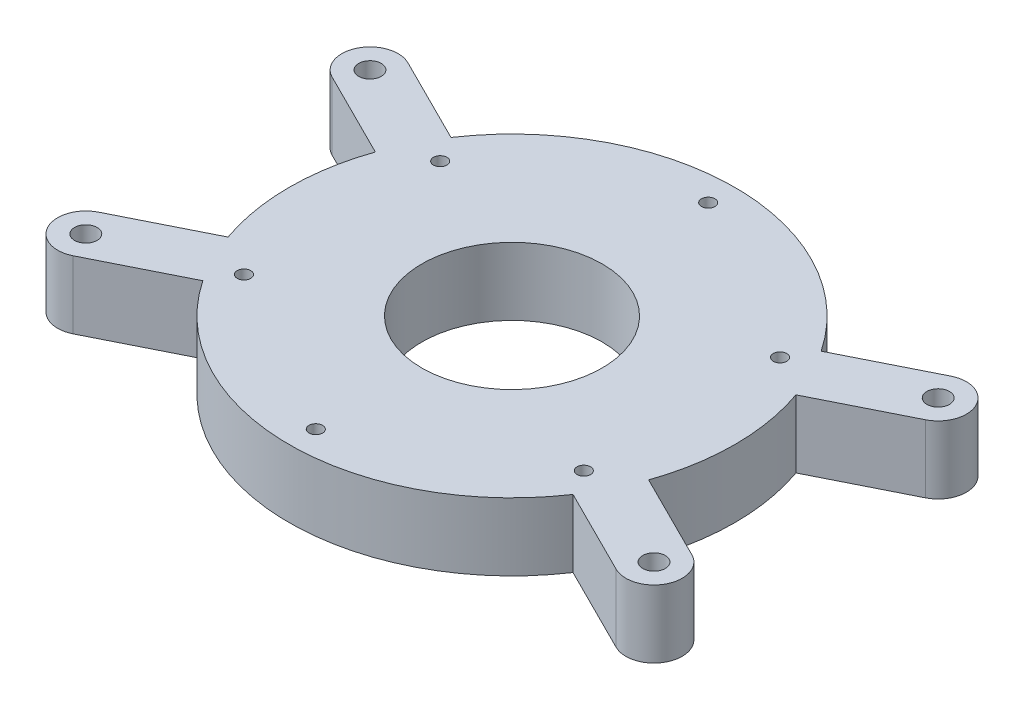
ISO-10303-21;
HEADER;
FILE_DESCRIPTION(('STEP AP214'),'2;1');
FILE_NAME('part.step','',(''),(''),'','','');
FILE_SCHEMA(('AUTOMOTIVE_DESIGN { 1 0 10303 214 1 1 1 1 }'));
ENDSEC;
DATA;
#1=APPLICATION_CONTEXT('core data for automotive mechanical design processes');
#2=APPLICATION_PROTOCOL_DEFINITION('international standard','automotive_design',2000,#1);
#3=PRODUCT_CONTEXT('',#1,'mechanical');
#4=PRODUCT('Part','Part','',(#3));
#5=PRODUCT_RELATED_PRODUCT_CATEGORY('part','',(#4));
#6=PRODUCT_DEFINITION_FORMATION('','',#4);
#7=PRODUCT_DEFINITION_CONTEXT('part definition',#1,'design');
#8=PRODUCT_DEFINITION('design','',#6,#7);
#9=PRODUCT_DEFINITION_SHAPE('','',#8);
#10=(LENGTH_UNIT() NAMED_UNIT(*) SI_UNIT(.MILLI.,.METRE.));
#11=(NAMED_UNIT(*) PLANE_ANGLE_UNIT() SI_UNIT($,.RADIAN.));
#12=(NAMED_UNIT(*) SI_UNIT($,.STERADIAN.) SOLID_ANGLE_UNIT());
#13=UNCERTAINTY_MEASURE_WITH_UNIT(LENGTH_MEASURE(1.E-05),#10,'distance_accuracy_value','');
#14=(GEOMETRIC_REPRESENTATION_CONTEXT(3) GLOBAL_UNCERTAINTY_ASSIGNED_CONTEXT((#13)) GLOBAL_UNIT_ASSIGNED_CONTEXT((#10,
#11,#12)) REPRESENTATION_CONTEXT('',''));
#15=CARTESIAN_POINT('',(0.,0.,0.));
#16=DIRECTION('',(0.,0.,1.));
#17=DIRECTION('',(1.,0.,0.));
#18=AXIS2_PLACEMENT_3D('',#15,#16,#17);
#19=CARTESIAN_POINT('',(0.,15.,0.));
#20=DIRECTION('',(0.,-1.,0.));
#21=DIRECTION('',(0.,0.,-1.));
#22=AXIS2_PLACEMENT_3D('',#19,#20,#21);
#23=CYLINDRICAL_SURFACE('',#22,49.4);
#24=CARTESIAN_POINT('',(0.,0.,0.));
#25=DIRECTION('',(0.,1.,0.));
#26=DIRECTION('',(0.,0.,1.));
#27=AXIS2_PLACEMENT_3D('',#24,#25,#26);
#28=CIRCLE('',#27,49.4);
#29=CARTESIAN_POINT('',(-41.0321866795471,0.,27.5085378799892));
#30=VERTEX_POINT('',#29);
#31=CARTESIAN_POINT('',(41.0321866795471,0.,27.5085378799891));
#32=VERTEX_POINT('',#31);
#33=EDGE_CURVE('E245',#30,#32,#28,.T.);
#34=ORIENTED_EDGE('',*,*,#33,.T.);
#35=DIRECTION('',(0.,-1.,0.));
#36=VECTOR('',#35,1.);
#37=CARTESIAN_POINT('',(41.0321866795471,15.,27.5085378799891));
#38=LINE('',#37,#36);
#39=CARTESIAN_POINT('',(41.0321866795471,15.,27.5085378799891));
#40=VERTEX_POINT('',#39);
#41=EDGE_CURVE('E12',#40,#32,#38,.T.);
#42=ORIENTED_EDGE('',*,*,#41,.F.);
#43=CARTESIAN_POINT('',(0.,15.,0.));
#44=DIRECTION('',(0.,1.,0.));
#45=DIRECTION('',(0.,0.,1.));
#46=AXIS2_PLACEMENT_3D('',#43,#44,#45);
#47=CIRCLE('',#46,49.4);
#48=CARTESIAN_POINT('',(-41.0321866795471,15.,27.5085378799892));
#49=VERTEX_POINT('',#48);
#50=EDGE_CURVE('E175',#49,#40,#47,.T.);
#51=ORIENTED_EDGE('',*,*,#50,.F.);
#52=DIRECTION('',(0.,-1.,0.));
#53=VECTOR('',#52,1.);
#54=CARTESIAN_POINT('',(-41.0321866795471,15.,27.5085378799892));
#55=LINE('',#54,#53);
#56=EDGE_CURVE('E241',#49,#30,#55,.T.);
#57=ORIENTED_EDGE('',*,*,#56,.T.);
#58=EDGE_LOOP('',(#34,#42,#51,#57));
#59=FACE_BOUND('',#58,.T.);
#60=ADVANCED_FACE('F93',(#59),#23,.T.);
#61=CARTESIAN_POINT('',(-2.79556780261693,15.,5.58992850231305));
#62=DIRECTION('',(-0.447290848418707,0.,0.894388560370085));
#63=DIRECTION('',(0.894388560370085,0.,0.447290848418707));
#64=AXIS2_PLACEMENT_3D('',#61,#62,#63);
#65=PLANE('',#64);
#66=DIRECTION('',(-0.894388560370085,0.,-0.447290848418707));
#67=VECTOR('',#66,1.);
#68=CARTESIAN_POINT('',(-2.79556780261693,0.,5.58992850231305));
#69=LINE('',#68,#67);
#70=CARTESIAN_POINT('',(60.1908307594318,0.,37.089928502313));
#71=VERTEX_POINT('',#70);
#72=EDGE_CURVE('E249',#71,#32,#69,.T.);
#73=ORIENTED_EDGE('',*,*,#72,.F.);
#74=DIRECTION('',(0.,-1.,0.));
#75=VECTOR('',#74,1.);
#76=CARTESIAN_POINT('',(60.1908307594318,15.,37.089928502313));
#77=LINE('',#76,#75);
#78=CARTESIAN_POINT('',(60.1908307594318,15.,37.089928502313));
#79=VERTEX_POINT('',#78);
#80=EDGE_CURVE('E103',#79,#71,#77,.T.);
#81=ORIENTED_EDGE('',*,*,#80,.F.);
#82=DIRECTION('',(-0.894388560370085,0.,-0.447290848418707));
#83=VECTOR('',#82,1.);
#84=CARTESIAN_POINT('',(-2.79556780261693,15.,5.58992850231305));
#85=LINE('',#84,#83);
#86=EDGE_CURVE('E327',#79,#40,#85,.T.);
#87=ORIENTED_EDGE('',*,*,#86,.T.);
#88=ORIENTED_EDGE('',*,*,#41,.T.);
#89=EDGE_LOOP('',(#73,#81,#87,#88));
#90=FACE_BOUND('',#89,.T.);
#91=ADVANCED_FACE('F408',(#90),#65,.T.);
#92=CARTESIAN_POINT('',(62.9863985620487,15.,31.5));
#93=DIRECTION('',(0.,-1.,0.));
#94=DIRECTION('',(0.,0.,-1.));
#95=AXIS2_PLACEMENT_3D('',#92,#93,#94);
#96=CYLINDRICAL_SURFACE('',#95,6.25);
#97=CARTESIAN_POINT('',(62.9863985620487,0.,31.5));
#98=DIRECTION('',(0.,1.,0.));
#99=DIRECTION('',(0.,0.,1.));
#100=AXIS2_PLACEMENT_3D('',#97,#98,#99);
#101=CIRCLE('',#100,6.25);
#102=CARTESIAN_POINT('',(65.7819663646656,0.,25.9100714976869));
#103=VERTEX_POINT('',#102);
#104=EDGE_CURVE('E254',#103,#71,#101,.F.);
#105=ORIENTED_EDGE('',*,*,#104,.F.);
#106=DIRECTION('',(0.,-1.,0.));
#107=VECTOR('',#106,1.);
#108=CARTESIAN_POINT('',(65.7819663646656,15.,25.9100714976869));
#109=LINE('',#108,#107);
#110=CARTESIAN_POINT('',(65.7819663646656,15.,25.9100714976869));
#111=VERTEX_POINT('',#110);
#112=EDGE_CURVE('E301',#111,#103,#109,.T.);
#113=ORIENTED_EDGE('',*,*,#112,.F.);
#114=CARTESIAN_POINT('',(62.9863985620487,15.,31.5));
#115=DIRECTION('',(0.,1.,0.));
#116=DIRECTION('',(0.,0.,1.));
#117=AXIS2_PLACEMENT_3D('',#114,#115,#116);
#118=CIRCLE('',#117,6.25);
#119=EDGE_CURVE('E331',#111,#79,#118,.F.);
#120=ORIENTED_EDGE('',*,*,#119,.T.);
#121=ORIENTED_EDGE('',*,*,#80,.T.);
#122=EDGE_LOOP('',(#105,#113,#120,#121));
#123=FACE_BOUND('',#122,.T.);
#124=ADVANCED_FACE('F413',(#123),#96,.T.);
#125=CARTESIAN_POINT('',(2.7955678026169,15.,-5.58992850231299));
#126=DIRECTION('',(-0.447290848418707,0.,0.894388560370085));
#127=DIRECTION('',(0.894388560370085,0.,0.447290848418707));
#128=AXIS2_PLACEMENT_3D('',#125,#126,#127);
#129=PLANE('',#128);
#130=DIRECTION('',(-0.894388560370085,0.,-0.447290848418707));
#131=VECTOR('',#130,1.);
#132=CARTESIAN_POINT('',(2.7955678026169,0.,-5.58992850231299));
#133=LINE('',#132,#131);
#134=CARTESIAN_POINT('',(46.623322284781,0.,16.3286808753631));
#135=VERTEX_POINT('',#134);
#136=EDGE_CURVE('E257',#103,#135,#133,.T.);
#137=ORIENTED_EDGE('',*,*,#136,.T.);
#138=DIRECTION('',(0.,-1.,0.));
#139=VECTOR('',#138,1.);
#140=CARTESIAN_POINT('',(46.623322284781,15.,16.3286808753631));
#141=LINE('',#140,#139);
#142=CARTESIAN_POINT('',(46.623322284781,15.,16.3286808753631));
#143=VERTEX_POINT('',#142);
#144=EDGE_CURVE('E298',#143,#135,#141,.T.);
#145=ORIENTED_EDGE('',*,*,#144,.F.);
#146=DIRECTION('',(-0.894388560370085,0.,-0.447290848418707));
#147=VECTOR('',#146,1.);
#148=CARTESIAN_POINT('',(2.7955678026169,15.,-5.58992850231299));
#149=LINE('',#148,#147);
#150=EDGE_CURVE('E334',#111,#143,#149,.T.);
#151=ORIENTED_EDGE('',*,*,#150,.F.);
#152=ORIENTED_EDGE('',*,*,#112,.T.);
#153=EDGE_LOOP('',(#137,#145,#151,#152));
#154=FACE_BOUND('',#153,.T.);
#155=ADVANCED_FACE('F419',(#154),#129,.F.);
#156=CARTESIAN_POINT('',(46.6233222847809,0.,-16.3286808753631));
#157=VERTEX_POINT('',#156);
#158=EDGE_CURVE('E251',#135,#157,#28,.T.);
#159=ORIENTED_EDGE('',*,*,#158,.T.);
#160=DIRECTION('',(0.,-1.,0.));
#161=VECTOR('',#160,1.);
#162=CARTESIAN_POINT('',(46.6233222847809,15.,-16.3286808753631));
#163=LINE('',#162,#161);
#164=CARTESIAN_POINT('',(46.6233222847809,15.,-16.3286808753631));
#165=VERTEX_POINT('',#164);
#166=EDGE_CURVE('E296',#165,#157,#163,.T.);
#167=ORIENTED_EDGE('',*,*,#166,.F.);
#168=EDGE_CURVE('E328',#143,#165,#47,.T.);
#169=ORIENTED_EDGE('',*,*,#168,.F.);
#170=ORIENTED_EDGE('',*,*,#144,.T.);
#171=EDGE_LOOP('',(#159,#167,#169,#170));
#172=FACE_BOUND('',#171,.T.);
#173=ADVANCED_FACE('F355',(#172),#23,.T.);
#174=CARTESIAN_POINT('',(2.7955678026169,15.,5.58992850231299));
#175=DIRECTION('',(0.447290848418707,0.,0.894388560370085));
#176=DIRECTION('',(0.894388560370085,0.,-0.447290848418707));
#177=AXIS2_PLACEMENT_3D('',#174,#175,#176);
#178=PLANE('',#177);
#179=DIRECTION('',(-0.894388560370085,0.,0.447290848418707));
#180=VECTOR('',#179,1.);
#181=CARTESIAN_POINT('',(2.7955678026169,0.,5.58992850231299));
#182=LINE('',#181,#180);
#183=CARTESIAN_POINT('',(65.7819663646656,0.,-25.910071497687));
#184=VERTEX_POINT('',#183);
#185=EDGE_CURVE('E259',#184,#157,#182,.T.);
#186=ORIENTED_EDGE('',*,*,#185,.F.);
#187=DIRECTION('',(0.,-1.,0.));
#188=VECTOR('',#187,1.);
#189=CARTESIAN_POINT('',(65.7819663646656,15.,-25.910071497687));
#190=LINE('',#189,#188);
#191=CARTESIAN_POINT('',(65.7819663646656,15.,-25.910071497687));
#192=VERTEX_POINT('',#191);
#193=EDGE_CURVE('E294',#192,#184,#190,.T.);
#194=ORIENTED_EDGE('',*,*,#193,.F.);
#195=DIRECTION('',(-0.894388560370085,0.,0.447290848418707));
#196=VECTOR('',#195,1.);
#197=CARTESIAN_POINT('',(2.7955678026169,15.,5.58992850231299));
#198=LINE('',#197,#196);
#199=EDGE_CURVE('E336',#192,#165,#198,.T.);
#200=ORIENTED_EDGE('',*,*,#199,.T.);
#201=ORIENTED_EDGE('',*,*,#166,.T.);
#202=EDGE_LOOP('',(#186,#194,#200,#201));
#203=FACE_BOUND('',#202,.T.);
#204=ADVANCED_FACE('F359',(#203),#178,.T.);
#205=CARTESIAN_POINT('',(62.9863985620487,15.,-31.5));
#206=DIRECTION('',(0.,-1.,0.));
#207=DIRECTION('',(0.,0.,-1.));
#208=AXIS2_PLACEMENT_3D('',#205,#206,#207);
#209=CYLINDRICAL_SURFACE('',#208,6.25);
#210=CARTESIAN_POINT('',(62.9863985620487,0.,-31.5));
#211=DIRECTION('',(0.,1.,0.));
#212=DIRECTION('',(0.,0.,1.));
#213=AXIS2_PLACEMENT_3D('',#210,#211,#212);
#214=CIRCLE('',#213,6.25);
#215=CARTESIAN_POINT('',(60.1908307594318,0.,-37.089928502313));
#216=VERTEX_POINT('',#215);
#217=EDGE_CURVE('E262',#184,#216,#214,.T.);
#218=ORIENTED_EDGE('',*,*,#217,.T.);
#219=DIRECTION('',(0.,-1.,0.));
#220=VECTOR('',#219,1.);
#221=CARTESIAN_POINT('',(60.1908307594318,15.,-37.089928502313));
#222=LINE('',#221,#220);
#223=CARTESIAN_POINT('',(60.1908307594318,15.,-37.089928502313));
#224=VERTEX_POINT('',#223);
#225=EDGE_CURVE('E291',#224,#216,#222,.T.);
#226=ORIENTED_EDGE('',*,*,#225,.F.);
#227=CARTESIAN_POINT('',(62.9863985620487,15.,-31.5));
#228=DIRECTION('',(0.,1.,0.));
#229=DIRECTION('',(0.,0.,1.));
#230=AXIS2_PLACEMENT_3D('',#227,#228,#229);
#231=CIRCLE('',#230,6.25);
#232=EDGE_CURVE('E339',#192,#224,#231,.T.);
#233=ORIENTED_EDGE('',*,*,#232,.F.);
#234=ORIENTED_EDGE('',*,*,#193,.T.);
#235=EDGE_LOOP('',(#218,#226,#233,#234));
#236=FACE_BOUND('',#235,.T.);
#237=ADVANCED_FACE('F364',(#236),#209,.T.);
#238=CARTESIAN_POINT('',(-2.79556780261694,15.,-5.58992850231306));
#239=DIRECTION('',(0.447290848418708,0.,0.894388560370085));
#240=DIRECTION('',(0.894388560370085,0.,-0.447290848418708));
#241=AXIS2_PLACEMENT_3D('',#238,#239,#240);
#242=PLANE('',#241);
#243=DIRECTION('',(-0.894388560370085,0.,0.447290848418708));
#244=VECTOR('',#243,1.);
#245=CARTESIAN_POINT('',(-2.79556780261694,0.,-5.58992850231306));
#246=LINE('',#245,#244);
#247=CARTESIAN_POINT('',(41.0321866795471,0.,-27.5085378799892));
#248=VERTEX_POINT('',#247);
#249=EDGE_CURVE('E264',#216,#248,#246,.T.);
#250=ORIENTED_EDGE('',*,*,#249,.T.);
#251=DIRECTION('',(0.,-1.,0.));
#252=VECTOR('',#251,1.);
#253=CARTESIAN_POINT('',(41.0321866795471,15.,-27.5085378799892));
#254=LINE('',#253,#252);
#255=CARTESIAN_POINT('',(41.0321866795471,15.,-27.5085378799892));
#256=VERTEX_POINT('',#255);
#257=EDGE_CURVE('E288',#256,#248,#254,.T.);
#258=ORIENTED_EDGE('',*,*,#257,.F.);
#259=DIRECTION('',(-0.894388560370085,0.,0.447290848418708));
#260=VECTOR('',#259,1.);
#261=CARTESIAN_POINT('',(-2.79556780261694,15.,-5.58992850231306));
#262=LINE('',#261,#260);
#263=EDGE_CURVE('E341',#224,#256,#262,.T.);
#264=ORIENTED_EDGE('',*,*,#263,.F.);
#265=ORIENTED_EDGE('',*,*,#225,.T.);
#266=EDGE_LOOP('',(#250,#258,#264,#265));
#267=FACE_BOUND('',#266,.T.);
#268=ADVANCED_FACE('F368',(#267),#242,.F.);
#269=CARTESIAN_POINT('',(-41.0321866795471,0.,-27.5085378799892));
#270=VERTEX_POINT('',#269);
#271=EDGE_CURVE('E266',#248,#270,#28,.T.);
#272=ORIENTED_EDGE('',*,*,#271,.T.);
#273=DIRECTION('',(0.,-1.,0.));
#274=VECTOR('',#273,1.);
#275=CARTESIAN_POINT('',(-41.0321866795471,15.,-27.5085378799892));
#276=LINE('',#275,#274);
#277=CARTESIAN_POINT('',(-41.0321866795471,15.,-27.5085378799892));
#278=VERTEX_POINT('',#277);
#279=EDGE_CURVE('E286',#278,#270,#276,.T.);
#280=ORIENTED_EDGE('',*,*,#279,.F.);
#281=EDGE_CURVE('E236',#256,#278,#47,.T.);
#282=ORIENTED_EDGE('',*,*,#281,.F.);
#283=ORIENTED_EDGE('',*,*,#257,.T.);
#284=EDGE_LOOP('',(#272,#280,#282,#283));
#285=FACE_BOUND('',#284,.T.);
#286=ADVANCED_FACE('F373',(#285),#23,.T.);
#287=CARTESIAN_POINT('',(2.79556780261694,15.,-5.58992850231308));
#288=DIRECTION('',(0.447290848418708,0.,-0.894388560370085));
#289=DIRECTION('',(-0.894388560370085,0.,-0.447290848418708));
#290=AXIS2_PLACEMENT_3D('',#287,#288,#289);
#291=PLANE('',#290);
#292=DIRECTION('',(0.894388560370085,0.,0.447290848418708));
#293=VECTOR('',#292,1.);
#294=CARTESIAN_POINT('',(2.79556780261694,0.,-5.58992850231308));
#295=LINE('',#294,#293);
#296=CARTESIAN_POINT('',(-60.1908307594318,0.,-37.089928502313));
#297=VERTEX_POINT('',#296);
#298=EDGE_CURVE('E267',#297,#270,#295,.T.);
#299=ORIENTED_EDGE('',*,*,#298,.F.);
#300=DIRECTION('',(0.,-1.,0.));
#301=VECTOR('',#300,1.);
#302=CARTESIAN_POINT('',(-60.1908307594318,15.,-37.089928502313));
#303=LINE('',#302,#301);
#304=CARTESIAN_POINT('',(-60.1908307594318,15.,-37.089928502313));
#305=VERTEX_POINT('',#304);
#306=EDGE_CURVE('E284',#305,#297,#303,.T.);
#307=ORIENTED_EDGE('',*,*,#306,.F.);
#308=DIRECTION('',(0.894388560370085,0.,0.447290848418708));
#309=VECTOR('',#308,1.);
#310=CARTESIAN_POINT('',(2.79556780261694,15.,-5.58992850231308));
#311=LINE('',#310,#309);
#312=EDGE_CURVE('E342',#305,#278,#311,.T.);
#313=ORIENTED_EDGE('',*,*,#312,.T.);
#314=ORIENTED_EDGE('',*,*,#279,.T.);
#315=EDGE_LOOP('',(#299,#307,#313,#314));
#316=FACE_BOUND('',#315,.T.);
#317=ADVANCED_FACE('F374',(#316),#291,.T.);
#318=CARTESIAN_POINT('',(-2.79556780261689,15.,5.58992850231297));
#319=DIRECTION('',(0.447290848418707,0.,-0.894388560370085));
#320=DIRECTION('',(-0.894388560370085,0.,-0.447290848418707));
#321=AXIS2_PLACEMENT_3D('',#318,#319,#320);
#322=PLANE('',#321);
#323=DIRECTION('',(0.894388560370085,0.,0.447290848418707));
#324=VECTOR('',#323,1.);
#325=CARTESIAN_POINT('',(-2.79556780261689,0.,5.58992850231297));
#326=LINE('',#325,#324);
#327=CARTESIAN_POINT('',(-65.7819663646656,0.,-25.910071497687));
#328=VERTEX_POINT('',#327);
#329=CARTESIAN_POINT('',(-46.6233222847809,0.,-16.3286808753631));
#330=VERTEX_POINT('',#329);
#331=EDGE_CURVE('E270',#328,#330,#326,.T.);
#332=ORIENTED_EDGE('',*,*,#331,.T.);
#333=DIRECTION('',(0.,-1.,0.));
#334=VECTOR('',#333,1.);
#335=CARTESIAN_POINT('',(-46.6233222847809,15.,-16.3286808753631));
#336=LINE('',#335,#334);
#337=CARTESIAN_POINT('',(-46.6233222847809,15.,-16.3286808753631));
#338=VERTEX_POINT('',#337);
#339=EDGE_CURVE('E279',#338,#330,#336,.T.);
#340=ORIENTED_EDGE('',*,*,#339,.F.);
#341=DIRECTION('',(0.894388560370085,0.,0.447290848418707));
#342=VECTOR('',#341,1.);
#343=CARTESIAN_POINT('',(-2.79556780261689,15.,5.58992850231297));
#344=LINE('',#343,#342);
#345=CARTESIAN_POINT('',(-65.7819663646656,15.,-25.910071497687));
#346=VERTEX_POINT('',#345);
#347=EDGE_CURVE('E234',#346,#338,#344,.T.);
#348=ORIENTED_EDGE('',*,*,#347,.F.);
#349=DIRECTION('',(0.,-1.,0.));
#350=VECTOR('',#349,1.);
#351=CARTESIAN_POINT('',(-65.7819663646656,15.,-25.910071497687));
#352=LINE('',#351,#350);
#353=EDGE_CURVE('E282',#346,#328,#352,.T.);
#354=ORIENTED_EDGE('',*,*,#353,.T.);
#355=EDGE_LOOP('',(#332,#340,#348,#354));
#356=FACE_BOUND('',#355,.T.);
#357=ADVANCED_FACE('F421',(#356),#322,.F.);
#358=CARTESIAN_POINT('',(-46.6233222847809,0.,16.3286808753631));
#359=VERTEX_POINT('',#358);
#360=EDGE_CURVE('E250',#330,#359,#28,.T.);
#361=ORIENTED_EDGE('',*,*,#360,.T.);
#362=DIRECTION('',(0.,-1.,0.));
#363=VECTOR('',#362,1.);
#364=CARTESIAN_POINT('',(-46.6233222847809,15.,16.3286808753631));
#365=LINE('',#364,#363);
#366=CARTESIAN_POINT('',(-46.6233222847809,15.,16.3286808753631));
#367=VERTEX_POINT('',#366);
#368=EDGE_CURVE('E223',#367,#359,#365,.T.);
#369=ORIENTED_EDGE('',*,*,#368,.F.);
#370=EDGE_CURVE('E231',#338,#367,#47,.T.);
#371=ORIENTED_EDGE('',*,*,#370,.F.);
#372=ORIENTED_EDGE('',*,*,#339,.T.);
#373=EDGE_LOOP('',(#361,#369,#371,#372));
#374=FACE_BOUND('',#373,.T.);
#375=ADVANCED_FACE('F380',(#374),#23,.T.);
#376=CARTESIAN_POINT('',(-2.79556780261689,15.,-5.58992850231297));
#377=DIRECTION('',(-0.447290848418707,0.,-0.894388560370085));
#378=DIRECTION('',(-0.894388560370085,0.,0.447290848418707));
#379=AXIS2_PLACEMENT_3D('',#376,#377,#378);
#380=PLANE('',#379);
#381=DIRECTION('',(0.894388560370085,0.,-0.447290848418707));
#382=VECTOR('',#381,1.);
#383=CARTESIAN_POINT('',(-2.79556780261689,0.,-5.58992850231297));
#384=LINE('',#383,#382);
#385=CARTESIAN_POINT('',(-65.7819663646656,0.,25.910071497687));
#386=VERTEX_POINT('',#385);
#387=EDGE_CURVE('E222',#386,#359,#384,.T.);
#388=ORIENTED_EDGE('',*,*,#387,.F.);
#389=DIRECTION('',(0.,-1.,0.));
#390=VECTOR('',#389,1.);
#391=CARTESIAN_POINT('',(-65.7819663646656,15.,25.910071497687));
#392=LINE('',#391,#390);
#393=CARTESIAN_POINT('',(-65.7819663646656,15.,25.910071497687));
#394=VERTEX_POINT('',#393);
#395=EDGE_CURVE('E216',#394,#386,#392,.T.);
#396=ORIENTED_EDGE('',*,*,#395,.F.);
#397=DIRECTION('',(0.894388560370085,0.,-0.447290848418707));
#398=VECTOR('',#397,1.);
#399=CARTESIAN_POINT('',(-2.79556780261689,15.,-5.58992850231297));
#400=LINE('',#399,#398);
#401=EDGE_CURVE('E220',#394,#367,#400,.T.);
#402=ORIENTED_EDGE('',*,*,#401,.T.);
#403=ORIENTED_EDGE('',*,*,#368,.T.);
#404=EDGE_LOOP('',(#388,#396,#402,#403));
#405=FACE_BOUND('',#404,.T.);
#406=ADVANCED_FACE('F218',(#405),#380,.T.);
#407=CARTESIAN_POINT('',(-62.9863985620487,15.,31.5));
#408=DIRECTION('',(0.,-1.,0.));
#409=DIRECTION('',(0.,0.,-1.));
#410=AXIS2_PLACEMENT_3D('',#407,#408,#409);
#411=CYLINDRICAL_SURFACE('',#410,6.25000000000001);
#412=CARTESIAN_POINT('',(-62.9863985620487,0.,31.5));
#413=DIRECTION('',(0.,1.,0.));
#414=DIRECTION('',(0.,0.,1.));
#415=AXIS2_PLACEMENT_3D('',#412,#413,#414);
#416=CIRCLE('',#415,6.25000000000001);
#417=CARTESIAN_POINT('',(-60.1908307594318,0.,37.089928502313));
#418=VERTEX_POINT('',#417);
#419=EDGE_CURVE('E163',#386,#418,#416,.T.);
#420=ORIENTED_EDGE('',*,*,#419,.T.);
#421=DIRECTION('',(0.,-1.,0.));
#422=VECTOR('',#421,1.);
#423=CARTESIAN_POINT('',(-60.1908307594318,15.,37.089928502313));
#424=LINE('',#423,#422);
#425=CARTESIAN_POINT('',(-60.1908307594318,15.,37.089928502313));
#426=VERTEX_POINT('',#425);
#427=EDGE_CURVE('E224',#426,#418,#424,.T.);
#428=ORIENTED_EDGE('',*,*,#427,.F.);
#429=CARTESIAN_POINT('',(-62.9863985620487,15.,31.5));
#430=DIRECTION('',(0.,1.,0.));
#431=DIRECTION('',(0.,0.,1.));
#432=AXIS2_PLACEMENT_3D('',#429,#430,#431);
#433=CIRCLE('',#432,6.25000000000001);
#434=EDGE_CURVE('E226',#394,#426,#433,.T.);
#435=ORIENTED_EDGE('',*,*,#434,.F.);
#436=ORIENTED_EDGE('',*,*,#395,.T.);
#437=EDGE_LOOP('',(#420,#428,#435,#436));
#438=FACE_BOUND('',#437,.T.);
#439=ADVANCED_FACE('F227',(#438),#411,.T.);
#440=CARTESIAN_POINT('',(0.,15.,0.));
#441=DIRECTION('',(0.,-1.,0.));
#442=DIRECTION('',(0.,0.,-1.));
#443=AXIS2_PLACEMENT_3D('',#440,#441,#442);
#444=CYLINDRICAL_SURFACE('',#443,20.);
#445=CARTESIAN_POINT('',(0.,15.,0.));
#446=DIRECTION('',(0.,1.,0.));
#447=DIRECTION('',(0.,0.,1.));
#448=AXIS2_PLACEMENT_3D('',#445,#446,#447);
#449=CIRCLE('',#448,20.);
#450=CARTESIAN_POINT('',(0.,15.,20.));
#451=VERTEX_POINT('',#450);
#452=EDGE_CURVE('E275',#451,#451,#449,.T.);
#453=ORIENTED_EDGE('',*,*,#452,.T.);
#454=EDGE_LOOP('',(#453));
#455=FACE_BOUND('',#454,.T.);
#456=CARTESIAN_POINT('',(0.,0.,0.));
#457=DIRECTION('',(0.,1.,0.));
#458=DIRECTION('',(0.,0.,1.));
#459=AXIS2_PLACEMENT_3D('',#456,#457,#458);
#460=CIRCLE('',#459,20.);
#461=CARTESIAN_POINT('',(0.,0.,20.));
#462=VERTEX_POINT('',#461);
#463=EDGE_CURVE('E242',#462,#462,#460,.T.);
#464=ORIENTED_EDGE('',*,*,#463,.F.);
#465=EDGE_LOOP('',(#464));
#466=FACE_BOUND('',#465,.T.);
#467=ADVANCED_FACE('F386',(#455,#466),#444,.F.);
#468=CARTESIAN_POINT('',(2.79556780261694,15.,5.58992850231308));
#469=DIRECTION('',(-0.447290848418708,0.,-0.894388560370085));
#470=DIRECTION('',(-0.894388560370085,0.,0.447290848418708));
#471=AXIS2_PLACEMENT_3D('',#468,#469,#470);
#472=PLANE('',#471);
#473=DIRECTION('',(0.894388560370085,0.,-0.447290848418708));
#474=VECTOR('',#473,1.);
#475=CARTESIAN_POINT('',(2.79556780261694,0.,5.58992850231308));
#476=LINE('',#475,#474);
#477=EDGE_CURVE('E169',#418,#30,#476,.T.);
#478=ORIENTED_EDGE('',*,*,#477,.T.);
#479=ORIENTED_EDGE('',*,*,#56,.F.);
#480=DIRECTION('',(0.894388560370085,0.,-0.447290848418708));
#481=VECTOR('',#480,1.);
#482=CARTESIAN_POINT('',(2.79556780261694,15.,5.58992850231308));
#483=LINE('',#482,#481);
#484=EDGE_CURVE('E112',#426,#49,#483,.T.);
#485=ORIENTED_EDGE('',*,*,#484,.F.);
#486=ORIENTED_EDGE('',*,*,#427,.T.);
#487=EDGE_LOOP('',(#478,#479,#485,#486));
#488=FACE_BOUND('',#487,.T.);
#489=ADVANCED_FACE('F384',(#488),#472,.F.);
#490=CARTESIAN_POINT('',(0.,15.,0.));
#491=DIRECTION('',(0.,1.,0.));
#492=DIRECTION('',(0.,0.,1.));
#493=AXIS2_PLACEMENT_3D('',#490,#491,#492);
#494=PLANE('',#493);
#495=CARTESIAN_POINT('',(37.6721050646228,15.,-21.7500000000004));
#496=DIRECTION('',(0.,-1.,0.));
#497=DIRECTION('',(0.866025403784433,0.,-0.50000000000001));
#498=AXIS2_PLACEMENT_3D('',#495,#496,#497);
#499=CIRCLE('',#498,1.5);
#500=CARTESIAN_POINT('',(38.9711431702995,15.,-22.5000000000005));
#501=VERTEX_POINT('',#500);
#502=EDGE_CURVE('E904',#501,#501,#499,.T.);
#503=ORIENTED_EDGE('',*,*,#502,.T.);
#504=EDGE_LOOP('',(#503));
#505=FACE_BOUND('',#504,.T.);
#506=CARTESIAN_POINT('',(37.6721050646233,15.,21.7499999999996));
#507=DIRECTION('',(0.,-1.,0.));
#508=DIRECTION('',(0.866025403784443,0.,0.499999999999992));
#509=AXIS2_PLACEMENT_3D('',#506,#507,#508);
#510=CIRCLE('',#509,1.5);
#511=CARTESIAN_POINT('',(38.9711431702999,15.,22.4999999999996));
#512=VERTEX_POINT('',#511);
#513=EDGE_CURVE('E1020',#512,#512,#510,.T.);
#514=ORIENTED_EDGE('',*,*,#513,.T.);
#515=EDGE_LOOP('',(#514));
#516=FACE_BOUND('',#515,.T.);
#517=CARTESIAN_POINT('',(0.,15.,43.5));
#518=DIRECTION('',(0.,-1.,0.));
#519=DIRECTION('',(0.,0.,1.));
#520=AXIS2_PLACEMENT_3D('',#517,#518,#519);
#521=CIRCLE('',#520,1.5);
#522=CARTESIAN_POINT('',(0.,15.,45.));
#523=VERTEX_POINT('',#522);
#524=EDGE_CURVE('E1012',#523,#523,#521,.T.);
#525=ORIENTED_EDGE('',*,*,#524,.T.);
#526=EDGE_LOOP('',(#525));
#527=FACE_BOUND('',#526,.T.);
#528=CARTESIAN_POINT('',(-37.672105064623,15.,21.7500000000002));
#529=DIRECTION('',(0.,-1.,0.));
#530=DIRECTION('',(-0.866025403784436,0.,0.500000000000004));
#531=AXIS2_PLACEMENT_3D('',#528,#529,#530);
#532=CIRCLE('',#531,1.5);
#533=CARTESIAN_POINT('',(-38.9711431702996,15.,22.5000000000002));
#534=VERTEX_POINT('',#533);
#535=EDGE_CURVE('E920',#534,#534,#532,.T.);
#536=ORIENTED_EDGE('',*,*,#535,.T.);
#537=EDGE_LOOP('',(#536));
#538=FACE_BOUND('',#537,.T.);
#539=CARTESIAN_POINT('',(-37.6721050646231,15.,-21.7499999999999));
#540=DIRECTION('',(0.,-1.,0.));
#541=DIRECTION('',(-0.86602540378444,0.,-0.499999999999998));
#542=AXIS2_PLACEMENT_3D('',#539,#540,#541);
#543=CIRCLE('',#542,1.5);
#544=CARTESIAN_POINT('',(-38.9711431702998,15.,-22.4999999999999));
#545=VERTEX_POINT('',#544);
#546=EDGE_CURVE('E913',#545,#545,#543,.T.);
#547=ORIENTED_EDGE('',*,*,#546,.T.);
#548=EDGE_LOOP('',(#547));
#549=FACE_BOUND('',#548,.T.);
#550=CARTESIAN_POINT('',(0.,15.,-43.5));
#551=DIRECTION('',(0.,-1.,0.));
#552=DIRECTION('',(0.,0.,-1.));
#553=AXIS2_PLACEMENT_3D('',#550,#551,#552);
#554=CIRCLE('',#553,1.5);
#555=CARTESIAN_POINT('',(0.,15.,-45.));
#556=VERTEX_POINT('',#555);
#557=EDGE_CURVE('E921',#556,#556,#554,.T.);
#558=ORIENTED_EDGE('',*,*,#557,.T.);
#559=EDGE_LOOP('',(#558));
#560=FACE_BOUND('',#559,.T.);
#561=CARTESIAN_POINT('',(62.9863985620487,15.,-31.5));
#562=DIRECTION('',(0.,-1.,0.));
#563=DIRECTION('',(0.,0.,1.));
#564=AXIS2_PLACEMENT_3D('',#561,#562,#563);
#565=CIRCLE('',#564,2.50000000000001);
#566=CARTESIAN_POINT('',(62.9863985620487,15.,-29.));
#567=VERTEX_POINT('',#566);
#568=EDGE_CURVE('E948',#567,#567,#565,.T.);
#569=ORIENTED_EDGE('',*,*,#568,.T.);
#570=EDGE_LOOP('',(#569));
#571=FACE_BOUND('',#570,.T.);
#572=CARTESIAN_POINT('',(62.9863985620487,15.,31.5));
#573=DIRECTION('',(0.,1.,0.));
#574=DIRECTION('',(0.,0.,-1.));
#575=AXIS2_PLACEMENT_3D('',#572,#573,#574);
#576=CIRCLE('',#575,2.50000000000001);
#577=CARTESIAN_POINT('',(62.9863985620487,15.,29.));
#578=VERTEX_POINT('',#577);
#579=EDGE_CURVE('E954',#578,#578,#576,.T.);
#580=ORIENTED_EDGE('',*,*,#579,.F.);
#581=EDGE_LOOP('',(#580));
#582=FACE_BOUND('',#581,.T.);
#583=CARTESIAN_POINT('',(-62.9863985620487,15.,31.5));
#584=DIRECTION('',(0.,-1.,0.));
#585=DIRECTION('',(0.,0.,-1.));
#586=AXIS2_PLACEMENT_3D('',#583,#584,#585);
#587=CIRCLE('',#586,2.50000000000001);
#588=CARTESIAN_POINT('',(-62.9863985620487,15.,29.));
#589=VERTEX_POINT('',#588);
#590=EDGE_CURVE('E322',#589,#589,#587,.T.);
#591=ORIENTED_EDGE('',*,*,#590,.T.);
#592=EDGE_LOOP('',(#591));
#593=FACE_BOUND('',#592,.T.);
#594=CARTESIAN_POINT('',(-62.9863985620487,15.,-31.5));
#595=DIRECTION('',(0.,1.,0.));
#596=DIRECTION('',(0.,0.,1.));
#597=AXIS2_PLACEMENT_3D('',#594,#595,#596);
#598=CIRCLE('',#597,2.50000000000001);
#599=CARTESIAN_POINT('',(-62.9863985620487,15.,-29.));
#600=VERTEX_POINT('',#599);
#601=EDGE_CURVE('E314',#600,#600,#598,.T.);
#602=ORIENTED_EDGE('',*,*,#601,.F.);
#603=EDGE_LOOP('',(#602));
#604=FACE_BOUND('',#603,.T.);
#605=ORIENTED_EDGE('',*,*,#452,.F.);
#606=EDGE_LOOP('',(#605));
#607=FACE_BOUND('',#606,.T.);
#608=ORIENTED_EDGE('',*,*,#50,.T.);
#609=ORIENTED_EDGE('',*,*,#86,.F.);
#610=ORIENTED_EDGE('',*,*,#119,.F.);
#611=ORIENTED_EDGE('',*,*,#150,.T.);
#612=ORIENTED_EDGE('',*,*,#168,.T.);
#613=ORIENTED_EDGE('',*,*,#199,.F.);
#614=ORIENTED_EDGE('',*,*,#232,.T.);
#615=ORIENTED_EDGE('',*,*,#263,.T.);
#616=ORIENTED_EDGE('',*,*,#281,.T.);
#617=ORIENTED_EDGE('',*,*,#312,.F.);
#618=CARTESIAN_POINT('',(-62.9863985620487,15.,-31.5));
#619=DIRECTION('',(0.,-1.,0.));
#620=DIRECTION('',(0.,0.,-1.));
#621=AXIS2_PLACEMENT_3D('',#618,#619,#620);
#622=CIRCLE('',#621,6.25000000000001);
#623=EDGE_CURVE('E246',#346,#305,#622,.T.);
#624=ORIENTED_EDGE('',*,*,#623,.F.);
#625=ORIENTED_EDGE('',*,*,#347,.T.);
#626=ORIENTED_EDGE('',*,*,#370,.T.);
#627=ORIENTED_EDGE('',*,*,#401,.F.);
#628=ORIENTED_EDGE('',*,*,#434,.T.);
#629=ORIENTED_EDGE('',*,*,#484,.T.);
#630=EDGE_LOOP('',(#608,#609,#610,#611,#612,#613,#614,#615,#616,#617,#624,#625,#626,#627,#628,#629));
#631=FACE_BOUND('',#630,.T.);
#632=ADVANCED_FACE('F229',(#505,#516,#527,#538,#549,#560,#571,#582,#593,#604,#607,#631),#494,.T.);
#633=CARTESIAN_POINT('',(0.,0.,0.));
#634=DIRECTION('',(0.,1.,0.));
#635=DIRECTION('',(0.,0.,1.));
#636=AXIS2_PLACEMENT_3D('',#633,#634,#635);
#637=PLANE('',#636);
#638=CARTESIAN_POINT('',(37.6721050646228,0.,-21.7500000000004));
#639=DIRECTION('',(0.,-1.,0.));
#640=DIRECTION('',(0.866025403784433,0.,-0.50000000000001));
#641=AXIS2_PLACEMENT_3D('',#638,#639,#640);
#642=CIRCLE('',#641,1.5);
#643=CARTESIAN_POINT('',(38.9711431702995,0.,-22.5000000000005));
#644=VERTEX_POINT('',#643);
#645=EDGE_CURVE('E907',#644,#644,#642,.T.);
#646=ORIENTED_EDGE('',*,*,#645,.F.);
#647=EDGE_LOOP('',(#646));
#648=FACE_BOUND('',#647,.T.);
#649=CARTESIAN_POINT('',(37.6721050646233,0.,21.7499999999996));
#650=DIRECTION('',(0.,-1.,0.));
#651=DIRECTION('',(0.866025403784443,0.,0.499999999999992));
#652=AXIS2_PLACEMENT_3D('',#649,#650,#651);
#653=CIRCLE('',#652,1.5);
#654=CARTESIAN_POINT('',(38.9711431702999,0.,22.4999999999996));
#655=VERTEX_POINT('',#654);
#656=EDGE_CURVE('E909',#655,#655,#653,.T.);
#657=ORIENTED_EDGE('',*,*,#656,.F.);
#658=EDGE_LOOP('',(#657));
#659=FACE_BOUND('',#658,.T.);
#660=CARTESIAN_POINT('',(0.,0.,43.5));
#661=DIRECTION('',(0.,-1.,0.));
#662=DIRECTION('',(0.,0.,1.));
#663=AXIS2_PLACEMENT_3D('',#660,#661,#662);
#664=CIRCLE('',#663,1.5);
#665=CARTESIAN_POINT('',(0.,0.,45.));
#666=VERTEX_POINT('',#665);
#667=EDGE_CURVE('E1017',#666,#666,#664,.T.);
#668=ORIENTED_EDGE('',*,*,#667,.F.);
#669=EDGE_LOOP('',(#668));
#670=FACE_BOUND('',#669,.T.);
#671=CARTESIAN_POINT('',(-37.672105064623,0.,21.7500000000002));
#672=DIRECTION('',(0.,-1.,0.));
#673=DIRECTION('',(-0.866025403784436,0.,0.500000000000004));
#674=AXIS2_PLACEMENT_3D('',#671,#672,#673);
#675=CIRCLE('',#674,1.5);
#676=CARTESIAN_POINT('',(-38.9711431702996,0.,22.5000000000002));
#677=VERTEX_POINT('',#676);
#678=EDGE_CURVE('E1007',#677,#677,#675,.T.);
#679=ORIENTED_EDGE('',*,*,#678,.F.);
#680=EDGE_LOOP('',(#679));
#681=FACE_BOUND('',#680,.T.);
#682=CARTESIAN_POINT('',(-37.6721050646231,0.,-21.7499999999999));
#683=DIRECTION('',(0.,-1.,0.));
#684=DIRECTION('',(-0.86602540378444,0.,-0.499999999999998));
#685=AXIS2_PLACEMENT_3D('',#682,#683,#684);
#686=CIRCLE('',#685,1.5);
#687=CARTESIAN_POINT('',(-38.9711431702998,0.,-22.4999999999999));
#688=VERTEX_POINT('',#687);
#689=EDGE_CURVE('E917',#688,#688,#686,.T.);
#690=ORIENTED_EDGE('',*,*,#689,.F.);
#691=EDGE_LOOP('',(#690));
#692=FACE_BOUND('',#691,.T.);
#693=CARTESIAN_POINT('',(0.,0.,-43.5));
#694=DIRECTION('',(0.,-1.,0.));
#695=DIRECTION('',(0.,0.,-1.));
#696=AXIS2_PLACEMENT_3D('',#693,#694,#695);
#697=CIRCLE('',#696,1.5);
#698=CARTESIAN_POINT('',(0.,0.,-45.));
#699=VERTEX_POINT('',#698);
#700=EDGE_CURVE('E916',#699,#699,#697,.T.);
#701=ORIENTED_EDGE('',*,*,#700,.F.);
#702=EDGE_LOOP('',(#701));
#703=FACE_BOUND('',#702,.T.);
#704=CARTESIAN_POINT('',(-54.0425129583478,0.,-27.0270915158129));
#705=DIRECTION('',(0.,1.,0.));
#706=DIRECTION('',(0.,0.,1.));
#707=AXIS2_PLACEMENT_3D('',#704,#705,#706);
#708=CIRCLE('',#707,2.5);
#709=CARTESIAN_POINT('',(-54.0425129583478,0.,-24.5270915158129));
#710=VERTEX_POINT('',#709);
#711=EDGE_CURVE('E924',#710,#710,#708,.T.);
#712=ORIENTED_EDGE('',*,*,#711,.T.);
#713=EDGE_LOOP('',(#712));
#714=FACE_BOUND('',#713,.T.);
#715=CARTESIAN_POINT('',(54.0425129583478,0.,-27.0270915158129));
#716=DIRECTION('',(0.,-1.,0.));
#717=DIRECTION('',(0.,0.,1.));
#718=AXIS2_PLACEMENT_3D('',#715,#716,#717);
#719=CIRCLE('',#718,2.5);
#720=CARTESIAN_POINT('',(54.0425129583478,0.,-24.5270915158129));
#721=VERTEX_POINT('',#720);
#722=EDGE_CURVE('E930',#721,#721,#719,.T.);
#723=ORIENTED_EDGE('',*,*,#722,.F.);
#724=EDGE_LOOP('',(#723));
#725=FACE_BOUND('',#724,.T.);
#726=CARTESIAN_POINT('',(54.0425129583478,0.,27.0270915158129));
#727=DIRECTION('',(0.,1.,0.));
#728=DIRECTION('',(0.,0.,-1.));
#729=AXIS2_PLACEMENT_3D('',#726,#727,#728);
#730=CIRCLE('',#729,2.5);
#731=CARTESIAN_POINT('',(54.0425129583478,0.,24.5270915158129));
#732=VERTEX_POINT('',#731);
#733=EDGE_CURVE('E936',#732,#732,#730,.T.);
#734=ORIENTED_EDGE('',*,*,#733,.T.);
#735=EDGE_LOOP('',(#734));
#736=FACE_BOUND('',#735,.T.);
#737=CARTESIAN_POINT('',(-54.0425129583478,0.,27.0270915158129));
#738=DIRECTION('',(0.,-1.,0.));
#739=DIRECTION('',(0.,0.,-1.));
#740=AXIS2_PLACEMENT_3D('',#737,#738,#739);
#741=CIRCLE('',#740,2.5);
#742=CARTESIAN_POINT('',(-54.0425129583478,0.,24.5270915158129));
#743=VERTEX_POINT('',#742);
#744=EDGE_CURVE('E942',#743,#743,#741,.T.);
#745=ORIENTED_EDGE('',*,*,#744,.F.);
#746=EDGE_LOOP('',(#745));
#747=FACE_BOUND('',#746,.T.);
#748=ORIENTED_EDGE('',*,*,#463,.T.);
#749=EDGE_LOOP('',(#748));
#750=FACE_BOUND('',#749,.T.);
#751=ORIENTED_EDGE('',*,*,#33,.F.);
#752=ORIENTED_EDGE('',*,*,#477,.F.);
#753=ORIENTED_EDGE('',*,*,#419,.F.);
#754=ORIENTED_EDGE('',*,*,#387,.T.);
#755=ORIENTED_EDGE('',*,*,#360,.F.);
#756=ORIENTED_EDGE('',*,*,#331,.F.);
#757=CARTESIAN_POINT('',(-62.9863985620487,0.,-31.5));
#758=DIRECTION('',(0.,-1.,0.));
#759=DIRECTION('',(0.,0.,-1.));
#760=AXIS2_PLACEMENT_3D('',#757,#758,#759);
#761=CIRCLE('',#760,6.25000000000001);
#762=EDGE_CURVE('E97',#328,#297,#761,.T.);
#763=ORIENTED_EDGE('',*,*,#762,.T.);
#764=ORIENTED_EDGE('',*,*,#298,.T.);
#765=ORIENTED_EDGE('',*,*,#271,.F.);
#766=ORIENTED_EDGE('',*,*,#249,.F.);
#767=ORIENTED_EDGE('',*,*,#217,.F.);
#768=ORIENTED_EDGE('',*,*,#185,.T.);
#769=ORIENTED_EDGE('',*,*,#158,.F.);
#770=ORIENTED_EDGE('',*,*,#136,.F.);
#771=ORIENTED_EDGE('',*,*,#104,.T.);
#772=ORIENTED_EDGE('',*,*,#72,.T.);
#773=EDGE_LOOP('',(#751,#752,#753,#754,#755,#756,#763,#764,#765,#766,#767,#768,#769,#770,#771,#772));
#774=FACE_BOUND('',#773,.T.);
#775=ADVANCED_FACE('F376',(#648,#659,#670,#681,#692,#703,#714,#725,#736,#747,#750,#774),#637,.F.);
#776=CARTESIAN_POINT('',(-62.9863985620487,15.,-31.5));
#777=DIRECTION('',(0.,-1.,0.));
#778=DIRECTION('',(0.,0.,-1.));
#779=AXIS2_PLACEMENT_3D('',#776,#777,#778);
#780=CYLINDRICAL_SURFACE('',#779,6.25000000000001);
#781=ORIENTED_EDGE('',*,*,#623,.T.);
#782=ORIENTED_EDGE('',*,*,#306,.T.);
#783=ORIENTED_EDGE('',*,*,#762,.F.);
#784=ORIENTED_EDGE('',*,*,#353,.F.);
#785=EDGE_LOOP('',(#781,#782,#783,#784));
#786=FACE_BOUND('',#785,.T.);
#787=ADVANCED_FACE('F95',(#786),#780,.T.);
#788=CARTESIAN_POINT('',(-62.9863985620487,5.,-31.5));
#789=DIRECTION('',(0.,1.,0.));
#790=DIRECTION('',(0.,0.,1.));
#791=AXIS2_PLACEMENT_3D('',#788,#789,#790);
#792=CYLINDRICAL_SURFACE('',#791,2.50000000000001);
#793=CARTESIAN_POINT('',(-62.9863985620487,5.,-31.5));
#794=DIRECTION('',(0.,1.,0.));
#795=DIRECTION('',(0.,0.,1.));
#796=AXIS2_PLACEMENT_3D('',#793,#794,#795);
#797=CIRCLE('',#796,2.50000000000001);
#798=CARTESIAN_POINT('',(-62.9863985620487,5.,-29.));
#799=VERTEX_POINT('',#798);
#800=EDGE_CURVE('E308',#799,#799,#797,.T.);
#801=ORIENTED_EDGE('',*,*,#800,.F.);
#802=EDGE_LOOP('',(#801));
#803=FACE_BOUND('',#802,.T.);
#804=ORIENTED_EDGE('',*,*,#601,.T.);
#805=EDGE_LOOP('',(#804));
#806=FACE_BOUND('',#805,.T.);
#807=ADVANCED_FACE('F398',(#803,#806),#792,.F.);
#808=CARTESIAN_POINT('',(-62.9863985620487,5.,-31.5));
#809=DIRECTION('',(0.,1.,0.));
#810=DIRECTION('',(0.,0.,1.));
#811=AXIS2_PLACEMENT_3D('',#808,#809,#810);
#812=PLANE('',#811);
#813=ORIENTED_EDGE('',*,*,#800,.T.);
#814=EDGE_LOOP('',(#813));
#815=FACE_BOUND('',#814,.T.);
#816=ADVANCED_FACE('F403',(#815),#812,.T.);
#817=CARTESIAN_POINT('',(-62.9863985620487,5.,31.5));
#818=DIRECTION('',(0.,1.,0.));
#819=DIRECTION('',(0.,0.,1.));
#820=AXIS2_PLACEMENT_3D('',#817,#818,#819);
#821=CYLINDRICAL_SURFACE('',#820,2.50000000000001);
#822=CARTESIAN_POINT('',(-62.9863985620487,5.,31.5));
#823=DIRECTION('',(0.,-1.,0.));
#824=DIRECTION('',(0.,0.,-1.));
#825=AXIS2_PLACEMENT_3D('',#822,#823,#824);
#826=CIRCLE('',#825,2.50000000000001);
#827=CARTESIAN_POINT('',(-62.9863985620487,5.,29.));
#828=VERTEX_POINT('',#827);
#829=EDGE_CURVE('E319',#828,#828,#826,.T.);
#830=ORIENTED_EDGE('',*,*,#829,.T.);
#831=EDGE_LOOP('',(#830));
#832=FACE_BOUND('',#831,.T.);
#833=ORIENTED_EDGE('',*,*,#590,.F.);
#834=EDGE_LOOP('',(#833));
#835=FACE_BOUND('',#834,.T.);
#836=ADVANCED_FACE('F539',(#832,#835),#821,.F.);
#837=CARTESIAN_POINT('',(-62.9863985620487,5.,31.5));
#838=DIRECTION('',(0.,1.,0.));
#839=DIRECTION('',(0.,0.,-1.));
#840=AXIS2_PLACEMENT_3D('',#837,#838,#839);
#841=PLANE('',#840);
#842=ORIENTED_EDGE('',*,*,#829,.F.);
#843=EDGE_LOOP('',(#842));
#844=FACE_BOUND('',#843,.T.);
#845=ADVANCED_FACE('F549',(#844),#841,.T.);
#846=CARTESIAN_POINT('',(62.9863985620487,5.,31.5));
#847=DIRECTION('',(0.,1.,0.));
#848=DIRECTION('',(0.,0.,1.));
#849=AXIS2_PLACEMENT_3D('',#846,#847,#848);
#850=CYLINDRICAL_SURFACE('',#849,2.50000000000001);
#851=CARTESIAN_POINT('',(62.9863985620487,5.,31.5));
#852=DIRECTION('',(0.,1.,0.));
#853=DIRECTION('',(0.,0.,-1.));
#854=AXIS2_PLACEMENT_3D('',#851,#852,#853);
#855=CIRCLE('',#854,2.50000000000001);
#856=CARTESIAN_POINT('',(62.9863985620487,5.,29.));
#857=VERTEX_POINT('',#856);
#858=EDGE_CURVE('E957',#857,#857,#855,.T.);
#859=ORIENTED_EDGE('',*,*,#858,.F.);
#860=EDGE_LOOP('',(#859));
#861=FACE_BOUND('',#860,.T.);
#862=ORIENTED_EDGE('',*,*,#579,.T.);
#863=EDGE_LOOP('',(#862));
#864=FACE_BOUND('',#863,.T.);
#865=ADVANCED_FACE('F561',(#861,#864),#850,.F.);
#866=CARTESIAN_POINT('',(62.9863985620487,5.,31.5));
#867=DIRECTION('',(0.,1.,0.));
#868=DIRECTION('',(0.,0.,-1.));
#869=AXIS2_PLACEMENT_3D('',#866,#867,#868);
#870=PLANE('',#869);
#871=ORIENTED_EDGE('',*,*,#858,.T.);
#872=EDGE_LOOP('',(#871));
#873=FACE_BOUND('',#872,.T.);
#874=ADVANCED_FACE('F572',(#873),#870,.T.);
#875=CARTESIAN_POINT('',(62.9863985620487,5.,-31.5));
#876=DIRECTION('',(0.,1.,0.));
#877=DIRECTION('',(0.,0.,1.));
#878=AXIS2_PLACEMENT_3D('',#875,#876,#877);
#879=CYLINDRICAL_SURFACE('',#878,2.50000000000001);
#880=CARTESIAN_POINT('',(62.9863985620487,5.,-31.5));
#881=DIRECTION('',(0.,-1.,0.));
#882=DIRECTION('',(0.,0.,1.));
#883=AXIS2_PLACEMENT_3D('',#880,#881,#882);
#884=CIRCLE('',#883,2.50000000000001);
#885=CARTESIAN_POINT('',(62.9863985620487,5.,-29.));
#886=VERTEX_POINT('',#885);
#887=EDGE_CURVE('E951',#886,#886,#884,.T.);
#888=ORIENTED_EDGE('',*,*,#887,.T.);
#889=EDGE_LOOP('',(#888));
#890=FACE_BOUND('',#889,.T.);
#891=ORIENTED_EDGE('',*,*,#568,.F.);
#892=EDGE_LOOP('',(#891));
#893=FACE_BOUND('',#892,.T.);
#894=ADVANCED_FACE('F585',(#890,#893),#879,.F.);
#895=CARTESIAN_POINT('',(62.9863985620487,5.,-31.5));
#896=DIRECTION('',(0.,1.,0.));
#897=DIRECTION('',(0.,0.,1.));
#898=AXIS2_PLACEMENT_3D('',#895,#896,#897);
#899=PLANE('',#898);
#900=ORIENTED_EDGE('',*,*,#887,.F.);
#901=EDGE_LOOP('',(#900));
#902=FACE_BOUND('',#901,.T.);
#903=ADVANCED_FACE('F596',(#902),#899,.T.);
#904=CARTESIAN_POINT('',(-54.0425129583478,10.,27.0270915158129));
#905=DIRECTION('',(0.,-1.,0.));
#906=DIRECTION('',(0.,0.,-1.));
#907=AXIS2_PLACEMENT_3D('',#904,#905,#906);
#908=CYLINDRICAL_SURFACE('',#907,2.5);
#909=CARTESIAN_POINT('',(-54.0425129583478,10.,27.0270915158129));
#910=DIRECTION('',(0.,-1.,0.));
#911=DIRECTION('',(0.,0.,-1.));
#912=AXIS2_PLACEMENT_3D('',#909,#910,#911);
#913=CIRCLE('',#912,2.5);
#914=CARTESIAN_POINT('',(-54.0425129583478,10.,24.5270915158129));
#915=VERTEX_POINT('',#914);
#916=EDGE_CURVE('E945',#915,#915,#913,.T.);
#917=ORIENTED_EDGE('',*,*,#916,.F.);
#918=EDGE_LOOP('',(#917));
#919=FACE_BOUND('',#918,.T.);
#920=ORIENTED_EDGE('',*,*,#744,.T.);
#921=EDGE_LOOP('',(#920));
#922=FACE_BOUND('',#921,.T.);
#923=ADVANCED_FACE('F607',(#919,#922),#908,.F.);
#924=CARTESIAN_POINT('',(-54.0425129583478,10.,27.0270915158129));
#925=DIRECTION('',(0.,-1.,0.));
#926=DIRECTION('',(0.,0.,-1.));
#927=AXIS2_PLACEMENT_3D('',#924,#925,#926);
#928=PLANE('',#927);
#929=ORIENTED_EDGE('',*,*,#916,.T.);
#930=EDGE_LOOP('',(#929));
#931=FACE_BOUND('',#930,.T.);
#932=ADVANCED_FACE('F618',(#931),#928,.T.);
#933=CARTESIAN_POINT('',(54.0425129583478,10.,27.0270915158129));
#934=DIRECTION('',(0.,-1.,0.));
#935=DIRECTION('',(0.,0.,-1.));
#936=AXIS2_PLACEMENT_3D('',#933,#934,#935);
#937=CYLINDRICAL_SURFACE('',#936,2.5);
#938=CARTESIAN_POINT('',(54.0425129583478,10.,27.0270915158129));
#939=DIRECTION('',(0.,1.,0.));
#940=DIRECTION('',(0.,0.,-1.));
#941=AXIS2_PLACEMENT_3D('',#938,#939,#940);
#942=CIRCLE('',#941,2.5);
#943=CARTESIAN_POINT('',(54.0425129583478,10.,24.5270915158129));
#944=VERTEX_POINT('',#943);
#945=EDGE_CURVE('E939',#944,#944,#942,.T.);
#946=ORIENTED_EDGE('',*,*,#945,.T.);
#947=EDGE_LOOP('',(#946));
#948=FACE_BOUND('',#947,.T.);
#949=ORIENTED_EDGE('',*,*,#733,.F.);
#950=EDGE_LOOP('',(#949));
#951=FACE_BOUND('',#950,.T.);
#952=ADVANCED_FACE('F630',(#948,#951),#937,.F.);
#953=CARTESIAN_POINT('',(54.0425129583478,10.,27.0270915158129));
#954=DIRECTION('',(0.,-1.,0.));
#955=DIRECTION('',(0.,0.,-1.));
#956=AXIS2_PLACEMENT_3D('',#953,#954,#955);
#957=PLANE('',#956);
#958=ORIENTED_EDGE('',*,*,#945,.F.);
#959=EDGE_LOOP('',(#958));
#960=FACE_BOUND('',#959,.T.);
#961=ADVANCED_FACE('F641',(#960),#957,.T.);
#962=CARTESIAN_POINT('',(54.0425129583478,10.,-27.0270915158129));
#963=DIRECTION('',(0.,-1.,0.));
#964=DIRECTION('',(0.,0.,-1.));
#965=AXIS2_PLACEMENT_3D('',#962,#963,#964);
#966=CYLINDRICAL_SURFACE('',#965,2.5);
#967=CARTESIAN_POINT('',(54.0425129583478,10.,-27.0270915158129));
#968=DIRECTION('',(0.,-1.,0.));
#969=DIRECTION('',(0.,0.,1.));
#970=AXIS2_PLACEMENT_3D('',#967,#968,#969);
#971=CIRCLE('',#970,2.5);
#972=CARTESIAN_POINT('',(54.0425129583478,10.,-24.5270915158129));
#973=VERTEX_POINT('',#972);
#974=EDGE_CURVE('E933',#973,#973,#971,.T.);
#975=ORIENTED_EDGE('',*,*,#974,.F.);
#976=EDGE_LOOP('',(#975));
#977=FACE_BOUND('',#976,.T.);
#978=ORIENTED_EDGE('',*,*,#722,.T.);
#979=EDGE_LOOP('',(#978));
#980=FACE_BOUND('',#979,.T.);
#981=ADVANCED_FACE('F653',(#977,#980),#966,.F.);
#982=CARTESIAN_POINT('',(54.0425129583478,10.,-27.0270915158129));
#983=DIRECTION('',(0.,-1.,0.));
#984=DIRECTION('',(0.,0.,1.));
#985=AXIS2_PLACEMENT_3D('',#982,#983,#984);
#986=PLANE('',#985);
#987=ORIENTED_EDGE('',*,*,#974,.T.);
#988=EDGE_LOOP('',(#987));
#989=FACE_BOUND('',#988,.T.);
#990=ADVANCED_FACE('F664',(#989),#986,.T.);
#991=CARTESIAN_POINT('',(-54.0425129583478,10.,-27.0270915158129));
#992=DIRECTION('',(0.,-1.,0.));
#993=DIRECTION('',(0.,0.,-1.));
#994=AXIS2_PLACEMENT_3D('',#991,#992,#993);
#995=CYLINDRICAL_SURFACE('',#994,2.5);
#996=CARTESIAN_POINT('',(-54.0425129583478,10.,-27.0270915158129));
#997=DIRECTION('',(0.,1.,0.));
#998=DIRECTION('',(0.,0.,1.));
#999=AXIS2_PLACEMENT_3D('',#996,#997,#998);
#1000=CIRCLE('',#999,2.5);
#1001=CARTESIAN_POINT('',(-54.0425129583478,10.,-24.5270915158129));
#1002=VERTEX_POINT('',#1001);
#1003=EDGE_CURVE('E927',#1002,#1002,#1000,.T.);
#1004=ORIENTED_EDGE('',*,*,#1003,.T.);
#1005=EDGE_LOOP('',(#1004));
#1006=FACE_BOUND('',#1005,.T.);
#1007=ORIENTED_EDGE('',*,*,#711,.F.);
#1008=EDGE_LOOP('',(#1007));
#1009=FACE_BOUND('',#1008,.T.);
#1010=ADVANCED_FACE('F677',(#1006,#1009),#995,.F.);
#1011=CARTESIAN_POINT('',(-54.0425129583478,10.,-27.0270915158129));
#1012=DIRECTION('',(0.,-1.,0.));
#1013=DIRECTION('',(0.,0.,1.));
#1014=AXIS2_PLACEMENT_3D('',#1011,#1012,#1013);
#1015=PLANE('',#1014);
#1016=ORIENTED_EDGE('',*,*,#1003,.F.);
#1017=EDGE_LOOP('',(#1016));
#1018=FACE_BOUND('',#1017,.T.);
#1019=ADVANCED_FACE('F688',(#1018),#1015,.T.);
#1020=CARTESIAN_POINT('',(0.,15.,-43.5));
#1021=DIRECTION('',(0.,-1.,0.));
#1022=DIRECTION('',(0.,0.,-1.));
#1023=AXIS2_PLACEMENT_3D('',#1020,#1021,#1022);
#1024=CYLINDRICAL_SURFACE('',#1023,1.5);
#1025=ORIENTED_EDGE('',*,*,#557,.F.);
#1026=EDGE_LOOP('',(#1025));
#1027=FACE_BOUND('',#1026,.T.);
#1028=ORIENTED_EDGE('',*,*,#700,.T.);
#1029=EDGE_LOOP('',(#1028));
#1030=FACE_BOUND('',#1029,.T.);
#1031=ADVANCED_FACE('F699',(#1027,#1030),#1024,.F.);
#1032=CARTESIAN_POINT('',(-37.6721050646231,15.,-21.7499999999999));
#1033=DIRECTION('',(0.,-1.,0.));
#1034=DIRECTION('',(0.,0.,-1.));
#1035=AXIS2_PLACEMENT_3D('',#1032,#1033,#1034);
#1036=CYLINDRICAL_SURFACE('',#1035,1.5);
#1037=ORIENTED_EDGE('',*,*,#546,.F.);
#1038=EDGE_LOOP('',(#1037));
#1039=FACE_BOUND('',#1038,.T.);
#1040=ORIENTED_EDGE('',*,*,#689,.T.);
#1041=EDGE_LOOP('',(#1040));
#1042=FACE_BOUND('',#1041,.T.);
#1043=ADVANCED_FACE('F710',(#1039,#1042),#1036,.F.);
#1044=CARTESIAN_POINT('',(-37.672105064623,15.,21.7500000000002));
#1045=DIRECTION('',(0.,-1.,0.));
#1046=DIRECTION('',(0.,0.,-1.));
#1047=AXIS2_PLACEMENT_3D('',#1044,#1045,#1046);
#1048=CYLINDRICAL_SURFACE('',#1047,1.5);
#1049=ORIENTED_EDGE('',*,*,#535,.F.);
#1050=EDGE_LOOP('',(#1049));
#1051=FACE_BOUND('',#1050,.T.);
#1052=ORIENTED_EDGE('',*,*,#678,.T.);
#1053=EDGE_LOOP('',(#1052));
#1054=FACE_BOUND('',#1053,.T.);
#1055=ADVANCED_FACE('F735',(#1051,#1054),#1048,.F.);
#1056=CARTESIAN_POINT('',(0.,15.,43.5));
#1057=DIRECTION('',(0.,-1.,0.));
#1058=DIRECTION('',(0.,0.,-1.));
#1059=AXIS2_PLACEMENT_3D('',#1056,#1057,#1058);
#1060=CYLINDRICAL_SURFACE('',#1059,1.5);
#1061=ORIENTED_EDGE('',*,*,#524,.F.);
#1062=EDGE_LOOP('',(#1061));
#1063=FACE_BOUND('',#1062,.T.);
#1064=ORIENTED_EDGE('',*,*,#667,.T.);
#1065=EDGE_LOOP('',(#1064));
#1066=FACE_BOUND('',#1065,.T.);
#1067=ADVANCED_FACE('F747',(#1063,#1066),#1060,.F.);
#1068=CARTESIAN_POINT('',(37.6721050646233,15.,21.7499999999996));
#1069=DIRECTION('',(0.,-1.,0.));
#1070=DIRECTION('',(0.,0.,-1.));
#1071=AXIS2_PLACEMENT_3D('',#1068,#1069,#1070);
#1072=CYLINDRICAL_SURFACE('',#1071,1.5);
#1073=ORIENTED_EDGE('',*,*,#513,.F.);
#1074=EDGE_LOOP('',(#1073));
#1075=FACE_BOUND('',#1074,.T.);
#1076=ORIENTED_EDGE('',*,*,#656,.T.);
#1077=EDGE_LOOP('',(#1076));
#1078=FACE_BOUND('',#1077,.T.);
#1079=ADVANCED_FACE('F759',(#1075,#1078),#1072,.F.);
#1080=CARTESIAN_POINT('',(37.6721050646228,15.,-21.7500000000004));
#1081=DIRECTION('',(0.,-1.,0.));
#1082=DIRECTION('',(0.,0.,-1.));
#1083=AXIS2_PLACEMENT_3D('',#1080,#1081,#1082);
#1084=CYLINDRICAL_SURFACE('',#1083,1.5);
#1085=ORIENTED_EDGE('',*,*,#502,.F.);
#1086=EDGE_LOOP('',(#1085));
#1087=FACE_BOUND('',#1086,.T.);
#1088=ORIENTED_EDGE('',*,*,#645,.T.);
#1089=EDGE_LOOP('',(#1088));
#1090=FACE_BOUND('',#1089,.T.);
#1091=ADVANCED_FACE('F772',(#1087,#1090),#1084,.F.);
#1092=CLOSED_SHELL('',(#60,#91,#124,#155,#173,#204,#237,#268,#286,#317,#357,#375,#406,#439,#467,
#489,#632,#775,#787,#807,#816,#836,#845,#865,#874,#894,#903,#923,#932,#952,#961,#981,#990,#1010,
#1019,#1031,#1043,#1055,#1067,#1079,#1091));
#1093=MANIFOLD_SOLID_BREP('B2',#1092);
#1094=ADVANCED_BREP_SHAPE_REPRESENTATION('',(#18,#1093),#14);
#1095=SHAPE_DEFINITION_REPRESENTATION(#9,#1094);
ENDSEC;
END-ISO-10303-21;
